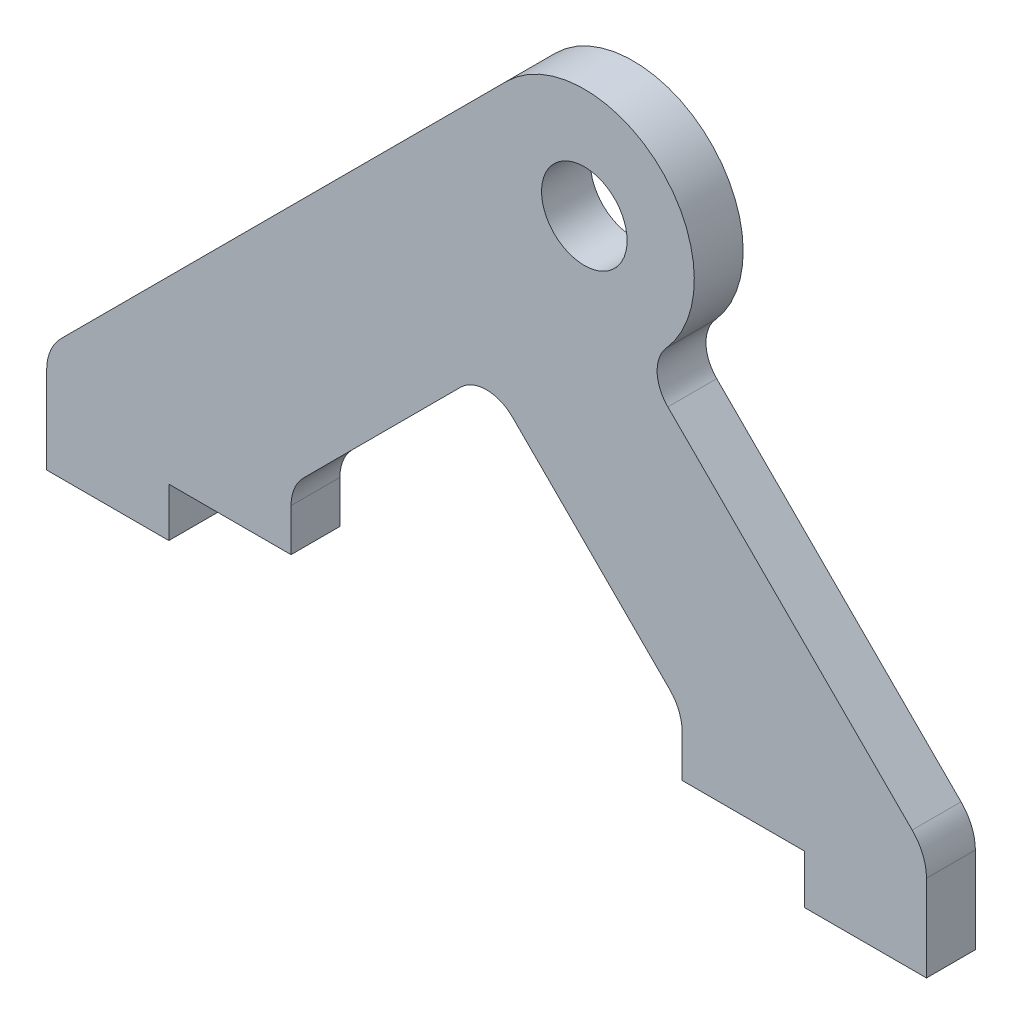
ISO-10303-21;
HEADER;
FILE_DESCRIPTION(('STEP AP214'),'2;1');
FILE_NAME('part.step','',(''),(''),'','','');
FILE_SCHEMA(('AUTOMOTIVE_DESIGN { 1 0 10303 214 1 1 1 1 }'));
ENDSEC;
DATA;
#1=APPLICATION_CONTEXT('core data for automotive mechanical design processes');
#2=APPLICATION_PROTOCOL_DEFINITION('international standard','automotive_design',2000,#1);
#3=PRODUCT_CONTEXT('',#1,'mechanical');
#4=PRODUCT('Part','Part','',(#3));
#5=PRODUCT_RELATED_PRODUCT_CATEGORY('part','',(#4));
#6=PRODUCT_DEFINITION_FORMATION('','',#4);
#7=PRODUCT_DEFINITION_CONTEXT('part definition',#1,'design');
#8=PRODUCT_DEFINITION('design','',#6,#7);
#9=PRODUCT_DEFINITION_SHAPE('','',#8);
#10=(LENGTH_UNIT() NAMED_UNIT(*) SI_UNIT(.MILLI.,.METRE.));
#11=(NAMED_UNIT(*) PLANE_ANGLE_UNIT() SI_UNIT($,.RADIAN.));
#12=(NAMED_UNIT(*) SI_UNIT($,.STERADIAN.) SOLID_ANGLE_UNIT());
#13=UNCERTAINTY_MEASURE_WITH_UNIT(LENGTH_MEASURE(1.E-05),#10,'distance_accuracy_value','');
#14=(GEOMETRIC_REPRESENTATION_CONTEXT(3) GLOBAL_UNCERTAINTY_ASSIGNED_CONTEXT((#13)) GLOBAL_UNIT_ASSIGNED_CONTEXT((#10,
#11,#12)) REPRESENTATION_CONTEXT('',''));
#15=CARTESIAN_POINT('',(0.,0.,0.));
#16=DIRECTION('',(0.,0.,1.));
#17=DIRECTION('',(1.,0.,0.));
#18=AXIS2_PLACEMENT_3D('',#15,#16,#17);
#19=CARTESIAN_POINT('',(26.4783372646557,16.0069441095828,2.));
#20=DIRECTION('',(0.,0.,-1.));
#21=DIRECTION('',(-1.,0.,0.));
#22=AXIS2_PLACEMENT_3D('',#19,#20,#21);
#23=PLANE('',#22);
#24=CARTESIAN_POINT('',(26.4783372646557,16.0069441095828,2.));
#25=DIRECTION('',(0.,0.,-1.));
#26=DIRECTION('',(-1.,0.,0.));
#27=AXIS2_PLACEMENT_3D('',#24,#25,#26);
#28=CIRCLE('',#27,1.5);
#29=CARTESIAN_POINT('',(25.4176770928759,14.9462839378029,2.));
#30=VERTEX_POINT('',#29);
#31=CARTESIAN_POINT('',(25.3587529484918,17.0052080821871,2.));
#32=VERTEX_POINT('',#31);
#33=EDGE_CURVE('E250',#30,#32,#28,.T.);
#34=ORIENTED_EDGE('',*,*,#33,.T.);
#35=CARTESIAN_POINT('',(22.,20.,2.));
#36=DIRECTION('',(0.,0.,1.));
#37=DIRECTION('',(1.,0.,0.));
#38=AXIS2_PLACEMENT_3D('',#35,#36,#37);
#39=CIRCLE('',#38,4.5);
#40=CARTESIAN_POINT('',(18.8180194846605,23.1819805153395,2.));
#41=VERTEX_POINT('',#40);
#42=EDGE_CURVE('E133',#32,#41,#39,.T.);
#43=ORIENTED_EDGE('',*,*,#42,.T.);
#44=DIRECTION('',(-0.707106781186546,-0.707106781186549,0.));
#45=VECTOR('',#44,1.);
#46=CARTESIAN_POINT('',(0.585786437626902,4.94974746830575,2.));
#47=LINE('',#46,#45);
#48=CARTESIAN_POINT('',(0.585786437626902,4.94974746830575,2.));
#49=VERTEX_POINT('',#48);
#50=EDGE_CURVE('E304',#41,#49,#47,.T.);
#51=ORIENTED_EDGE('',*,*,#50,.T.);
#52=CARTESIAN_POINT('',(2.,3.53553390593266,2.));
#53=DIRECTION('',(0.,0.,1.));
#54=DIRECTION('',(-1.,0.,0.));
#55=AXIS2_PLACEMENT_3D('',#52,#53,#54);
#56=CIRCLE('',#55,2.);
#57=CARTESIAN_POINT('',(0.,3.53553390593266,2.));
#58=VERTEX_POINT('',#57);
#59=EDGE_CURVE('E323',#49,#58,#56,.T.);
#60=ORIENTED_EDGE('',*,*,#59,.T.);
#61=DIRECTION('',(0.,-1.,0.));
#62=VECTOR('',#61,1.);
#63=CARTESIAN_POINT('',(0.,0.,2.));
#64=LINE('',#63,#62);
#65=CARTESIAN_POINT('',(0.,0.,2.));
#66=VERTEX_POINT('',#65);
#67=EDGE_CURVE('E320',#58,#66,#64,.T.);
#68=ORIENTED_EDGE('',*,*,#67,.T.);
#69=DIRECTION('',(1.,0.,0.));
#70=VECTOR('',#69,1.);
#71=CARTESIAN_POINT('',(0.,0.,2.));
#72=LINE('',#71,#70);
#73=CARTESIAN_POINT('',(5.,0.,2.));
#74=VERTEX_POINT('',#73);
#75=EDGE_CURVE('E322',#66,#74,#72,.T.);
#76=ORIENTED_EDGE('',*,*,#75,.T.);
#77=DIRECTION('',(0.,1.,0.));
#78=VECTOR('',#77,1.);
#79=CARTESIAN_POINT('',(5.,0.,2.));
#80=LINE('',#79,#78);
#81=CARTESIAN_POINT('',(5.,2.,2.));
#82=VERTEX_POINT('',#81);
#83=EDGE_CURVE('E325',#74,#82,#80,.T.);
#84=ORIENTED_EDGE('',*,*,#83,.T.);
#85=DIRECTION('',(1.,0.,0.));
#86=VECTOR('',#85,1.);
#87=CARTESIAN_POINT('',(5.,2.,2.));
#88=LINE('',#87,#86);
#89=CARTESIAN_POINT('',(10.,2.,2.));
#90=VERTEX_POINT('',#89);
#91=EDGE_CURVE('E331',#82,#90,#88,.T.);
#92=ORIENTED_EDGE('',*,*,#91,.T.);
#93=DIRECTION('',(0.,1.,0.));
#94=VECTOR('',#93,1.);
#95=CARTESIAN_POINT('',(10.,2.,2.));
#96=LINE('',#95,#94);
#97=CARTESIAN_POINT('',(10.,3.73959235991429,2.));
#98=VERTEX_POINT('',#97);
#99=EDGE_CURVE('E333',#90,#98,#96,.T.);
#100=ORIENTED_EDGE('',*,*,#99,.T.);
#101=CARTESIAN_POINT('',(11.75,3.73959235991429,2.));
#102=DIRECTION('',(0.,0.,-1.));
#103=DIRECTION('',(-1.,0.,0.));
#104=AXIS2_PLACEMENT_3D('',#101,#102,#103);
#105=CIRCLE('',#104,1.75);
#106=CARTESIAN_POINT('',(10.5125631329235,4.97702922699074,2.));
#107=VERTEX_POINT('',#106);
#108=EDGE_CURVE('E335',#98,#107,#105,.T.);
#109=ORIENTED_EDGE('',*,*,#108,.T.);
#110=DIRECTION('',(0.707106781186546,0.707106781186549,0.));
#111=VECTOR('',#110,1.);
#112=CARTESIAN_POINT('',(10.5125631329235,4.97702922699074,2.));
#113=LINE('',#112,#111);
#114=CARTESIAN_POINT('',(16.9393398282201,11.4038059222874,2.));
#115=VERTEX_POINT('',#114);
#116=EDGE_CURVE('E337',#107,#115,#113,.T.);
#117=ORIENTED_EDGE('',*,*,#116,.T.);
#118=CARTESIAN_POINT('',(18.,10.3431457505076,2.));
#119=DIRECTION('',(0.,0.,-1.));
#120=DIRECTION('',(-1.,0.,0.));
#121=AXIS2_PLACEMENT_3D('',#118,#119,#120);
#122=CIRCLE('',#121,1.5);
#123=CARTESIAN_POINT('',(19.0606601717798,11.4038059222874,2.));
#124=VERTEX_POINT('',#123);
#125=EDGE_CURVE('E339',#115,#124,#122,.T.);
#126=ORIENTED_EDGE('',*,*,#125,.T.);
#127=DIRECTION('',(0.707106781186549,-0.707106781186546,0.));
#128=VECTOR('',#127,1.);
#129=CARTESIAN_POINT('',(19.0606601717798,11.4038059222874,2.));
#130=LINE('',#129,#128);
#131=CARTESIAN_POINT('',(25.4874368670765,4.97702922699075,2.));
#132=VERTEX_POINT('',#131);
#133=EDGE_CURVE('E341',#124,#132,#130,.T.);
#134=ORIENTED_EDGE('',*,*,#133,.T.);
#135=CARTESIAN_POINT('',(24.25,3.73959235991429,2.));
#136=DIRECTION('',(0.,0.,-1.));
#137=DIRECTION('',(-1.,0.,0.));
#138=AXIS2_PLACEMENT_3D('',#135,#136,#137);
#139=CIRCLE('',#138,1.75);
#140=CARTESIAN_POINT('',(26.,3.73959235991429,2.));
#141=VERTEX_POINT('',#140);
#142=EDGE_CURVE('E343',#132,#141,#139,.T.);
#143=ORIENTED_EDGE('',*,*,#142,.T.);
#144=DIRECTION('',(0.,-1.,0.));
#145=VECTOR('',#144,1.);
#146=CARTESIAN_POINT('',(26.,3.73959235991429,2.));
#147=LINE('',#146,#145);
#148=CARTESIAN_POINT('',(26.,2.,2.));
#149=VERTEX_POINT('',#148);
#150=EDGE_CURVE('E345',#141,#149,#147,.T.);
#151=ORIENTED_EDGE('',*,*,#150,.T.);
#152=DIRECTION('',(1.,0.,0.));
#153=VECTOR('',#152,1.);
#154=CARTESIAN_POINT('',(26.,2.,2.));
#155=LINE('',#154,#153);
#156=CARTESIAN_POINT('',(31.,2.,2.));
#157=VERTEX_POINT('',#156);
#158=EDGE_CURVE('E347',#149,#157,#155,.T.);
#159=ORIENTED_EDGE('',*,*,#158,.T.);
#160=DIRECTION('',(0.,-1.,0.));
#161=VECTOR('',#160,1.);
#162=CARTESIAN_POINT('',(31.,2.,2.));
#163=LINE('',#162,#161);
#164=CARTESIAN_POINT('',(31.,0.,2.));
#165=VERTEX_POINT('',#164);
#166=EDGE_CURVE('E349',#157,#165,#163,.T.);
#167=ORIENTED_EDGE('',*,*,#166,.T.);
#168=DIRECTION('',(1.,0.,0.));
#169=VECTOR('',#168,1.);
#170=CARTESIAN_POINT('',(31.,0.,2.));
#171=LINE('',#170,#169);
#172=CARTESIAN_POINT('',(36.,0.,2.));
#173=VERTEX_POINT('',#172);
#174=EDGE_CURVE('E191',#165,#173,#171,.T.);
#175=ORIENTED_EDGE('',*,*,#174,.T.);
#176=DIRECTION('',(0.,1.,0.));
#177=VECTOR('',#176,1.);
#178=CARTESIAN_POINT('',(36.,0.,2.));
#179=LINE('',#178,#177);
#180=CARTESIAN_POINT('',(36.,3.5355339059327,2.));
#181=VERTEX_POINT('',#180);
#182=EDGE_CURVE('E185',#173,#181,#179,.T.);
#183=ORIENTED_EDGE('',*,*,#182,.T.);
#184=CARTESIAN_POINT('',(34.,3.5355339059327,2.));
#185=DIRECTION('',(0.,0.,1.));
#186=DIRECTION('',(1.,0.,0.));
#187=AXIS2_PLACEMENT_3D('',#184,#185,#186);
#188=CIRCLE('',#187,2.);
#189=CARTESIAN_POINT('',(35.4142135623731,4.94974746830579,2.));
#190=VERTEX_POINT('',#189);
#191=EDGE_CURVE('E189',#181,#190,#188,.T.);
#192=ORIENTED_EDGE('',*,*,#191,.T.);
#193=DIRECTION('',(-0.707106781186549,0.707106781186546,0.));
#194=VECTOR('',#193,1.);
#195=CARTESIAN_POINT('',(35.4142135623731,4.94974746830579,2.));
#196=LINE('',#195,#194);
#197=EDGE_CURVE('E51',#190,#30,#196,.T.);
#198=ORIENTED_EDGE('',*,*,#197,.T.);
#199=EDGE_LOOP('',(#34,#43,#51,#60,#68,#76,#84,#92,#100,#109,#117,#126,#134,#143,#151,#159,#167,
#175,#183,#192,#198));
#200=FACE_BOUND('',#199,.T.);
#201=CARTESIAN_POINT('',(22.,20.,2.));
#202=DIRECTION('',(0.,0.,1.));
#203=DIRECTION('',(1.,0.,0.));
#204=AXIS2_PLACEMENT_3D('',#201,#202,#203);
#205=CIRCLE('',#204,1.75);
#206=CARTESIAN_POINT('',(23.75,20.,2.));
#207=VERTEX_POINT('',#206);
#208=EDGE_CURVE('E213',#207,#207,#205,.T.);
#209=ORIENTED_EDGE('',*,*,#208,.F.);
#210=EDGE_LOOP('',(#209));
#211=FACE_BOUND('',#210,.T.);
#212=ADVANCED_FACE('F34',(#200,#211),#23,.F.);
#213=CARTESIAN_POINT('',(26.4783372646557,16.0069441095828,0.));
#214=DIRECTION('',(0.,0.,-1.));
#215=DIRECTION('',(-1.,0.,0.));
#216=AXIS2_PLACEMENT_3D('',#213,#214,#215);
#217=PLANE('',#216);
#218=CARTESIAN_POINT('',(26.4783372646557,16.0069441095828,0.));
#219=DIRECTION('',(0.,0.,-1.));
#220=DIRECTION('',(-1.,0.,0.));
#221=AXIS2_PLACEMENT_3D('',#218,#219,#220);
#222=CIRCLE('',#221,1.5);
#223=CARTESIAN_POINT('',(25.4176770928759,14.9462839378029,0.));
#224=VERTEX_POINT('',#223);
#225=CARTESIAN_POINT('',(25.3587529484918,17.0052080821871,0.));
#226=VERTEX_POINT('',#225);
#227=EDGE_CURVE('E209',#224,#226,#222,.T.);
#228=ORIENTED_EDGE('',*,*,#227,.F.);
#229=DIRECTION('',(-0.707106781186549,0.707106781186546,0.));
#230=VECTOR('',#229,1.);
#231=CARTESIAN_POINT('',(35.4142135623731,4.94974746830579,0.));
#232=LINE('',#231,#230);
#233=CARTESIAN_POINT('',(35.4142135623731,4.94974746830579,0.));
#234=VERTEX_POINT('',#233);
#235=EDGE_CURVE('E125',#234,#224,#232,.T.);
#236=ORIENTED_EDGE('',*,*,#235,.F.);
#237=CARTESIAN_POINT('',(34.,3.5355339059327,0.));
#238=DIRECTION('',(0.,0.,1.));
#239=DIRECTION('',(1.,0.,0.));
#240=AXIS2_PLACEMENT_3D('',#237,#238,#239);
#241=CIRCLE('',#240,2.);
#242=CARTESIAN_POINT('',(36.,3.5355339059327,0.));
#243=VERTEX_POINT('',#242);
#244=EDGE_CURVE('E119',#243,#234,#241,.T.);
#245=ORIENTED_EDGE('',*,*,#244,.F.);
#246=DIRECTION('',(0.,1.,0.));
#247=VECTOR('',#246,1.);
#248=CARTESIAN_POINT('',(36.,0.,0.));
#249=LINE('',#248,#247);
#250=CARTESIAN_POINT('',(36.,0.,0.));
#251=VERTEX_POINT('',#250);
#252=EDGE_CURVE('E199',#251,#243,#249,.T.);
#253=ORIENTED_EDGE('',*,*,#252,.F.);
#254=DIRECTION('',(1.,0.,0.));
#255=VECTOR('',#254,1.);
#256=CARTESIAN_POINT('',(31.,0.,0.));
#257=LINE('',#256,#255);
#258=CARTESIAN_POINT('',(31.,0.,0.));
#259=VERTEX_POINT('',#258);
#260=EDGE_CURVE('E245',#259,#251,#257,.T.);
#261=ORIENTED_EDGE('',*,*,#260,.F.);
#262=DIRECTION('',(0.,-1.,0.));
#263=VECTOR('',#262,1.);
#264=CARTESIAN_POINT('',(31.,2.,0.));
#265=LINE('',#264,#263);
#266=CARTESIAN_POINT('',(31.,2.,0.));
#267=VERTEX_POINT('',#266);
#268=EDGE_CURVE('E243',#267,#259,#265,.T.);
#269=ORIENTED_EDGE('',*,*,#268,.F.);
#270=DIRECTION('',(1.,0.,0.));
#271=VECTOR('',#270,1.);
#272=CARTESIAN_POINT('',(26.,2.,0.));
#273=LINE('',#272,#271);
#274=CARTESIAN_POINT('',(26.,2.,0.));
#275=VERTEX_POINT('',#274);
#276=EDGE_CURVE('E241',#275,#267,#273,.T.);
#277=ORIENTED_EDGE('',*,*,#276,.F.);
#278=DIRECTION('',(0.,-1.,0.));
#279=VECTOR('',#278,1.);
#280=CARTESIAN_POINT('',(26.,3.73959235991429,0.));
#281=LINE('',#280,#279);
#282=CARTESIAN_POINT('',(26.,3.73959235991429,0.));
#283=VERTEX_POINT('',#282);
#284=EDGE_CURVE('E239',#283,#275,#281,.T.);
#285=ORIENTED_EDGE('',*,*,#284,.F.);
#286=CARTESIAN_POINT('',(24.25,3.73959235991429,0.));
#287=DIRECTION('',(0.,0.,-1.));
#288=DIRECTION('',(-1.,0.,0.));
#289=AXIS2_PLACEMENT_3D('',#286,#287,#288);
#290=CIRCLE('',#289,1.75);
#291=CARTESIAN_POINT('',(25.4874368670765,4.97702922699075,0.));
#292=VERTEX_POINT('',#291);
#293=EDGE_CURVE('E237',#292,#283,#290,.T.);
#294=ORIENTED_EDGE('',*,*,#293,.F.);
#295=DIRECTION('',(0.707106781186549,-0.707106781186546,0.));
#296=VECTOR('',#295,1.);
#297=CARTESIAN_POINT('',(19.0606601717798,11.4038059222874,0.));
#298=LINE('',#297,#296);
#299=CARTESIAN_POINT('',(19.0606601717798,11.4038059222874,0.));
#300=VERTEX_POINT('',#299);
#301=EDGE_CURVE('E235',#300,#292,#298,.T.);
#302=ORIENTED_EDGE('',*,*,#301,.F.);
#303=CARTESIAN_POINT('',(18.,10.3431457505076,0.));
#304=DIRECTION('',(0.,0.,-1.));
#305=DIRECTION('',(-1.,0.,0.));
#306=AXIS2_PLACEMENT_3D('',#303,#304,#305);
#307=CIRCLE('',#306,1.5);
#308=CARTESIAN_POINT('',(16.9393398282201,11.4038059222874,0.));
#309=VERTEX_POINT('',#308);
#310=EDGE_CURVE('E233',#309,#300,#307,.T.);
#311=ORIENTED_EDGE('',*,*,#310,.F.);
#312=DIRECTION('',(0.707106781186546,0.707106781186549,0.));
#313=VECTOR('',#312,1.);
#314=CARTESIAN_POINT('',(10.5125631329235,4.97702922699074,0.));
#315=LINE('',#314,#313);
#316=CARTESIAN_POINT('',(10.5125631329235,4.97702922699074,0.));
#317=VERTEX_POINT('',#316);
#318=EDGE_CURVE('E231',#317,#309,#315,.T.);
#319=ORIENTED_EDGE('',*,*,#318,.F.);
#320=CARTESIAN_POINT('',(11.75,3.73959235991429,0.));
#321=DIRECTION('',(0.,0.,-1.));
#322=DIRECTION('',(-1.,0.,0.));
#323=AXIS2_PLACEMENT_3D('',#320,#321,#322);
#324=CIRCLE('',#323,1.75);
#325=CARTESIAN_POINT('',(10.,3.73959235991429,0.));
#326=VERTEX_POINT('',#325);
#327=EDGE_CURVE('E229',#326,#317,#324,.T.);
#328=ORIENTED_EDGE('',*,*,#327,.F.);
#329=DIRECTION('',(0.,1.,0.));
#330=VECTOR('',#329,1.);
#331=CARTESIAN_POINT('',(10.,2.,0.));
#332=LINE('',#331,#330);
#333=CARTESIAN_POINT('',(10.,2.,0.));
#334=VERTEX_POINT('',#333);
#335=EDGE_CURVE('E227',#334,#326,#332,.T.);
#336=ORIENTED_EDGE('',*,*,#335,.F.);
#337=DIRECTION('',(1.,0.,0.));
#338=VECTOR('',#337,1.);
#339=CARTESIAN_POINT('',(5.,2.,0.));
#340=LINE('',#339,#338);
#341=CARTESIAN_POINT('',(5.,2.,0.));
#342=VERTEX_POINT('',#341);
#343=EDGE_CURVE('E225',#342,#334,#340,.T.);
#344=ORIENTED_EDGE('',*,*,#343,.F.);
#345=DIRECTION('',(0.,1.,0.));
#346=VECTOR('',#345,1.);
#347=CARTESIAN_POINT('',(5.,0.,0.));
#348=LINE('',#347,#346);
#349=CARTESIAN_POINT('',(5.,0.,0.));
#350=VERTEX_POINT('',#349);
#351=EDGE_CURVE('E223',#350,#342,#348,.T.);
#352=ORIENTED_EDGE('',*,*,#351,.F.);
#353=DIRECTION('',(1.,0.,0.));
#354=VECTOR('',#353,1.);
#355=CARTESIAN_POINT('',(0.,0.,0.));
#356=LINE('',#355,#354);
#357=CARTESIAN_POINT('',(0.,0.,0.));
#358=VERTEX_POINT('',#357);
#359=EDGE_CURVE('E221',#358,#350,#356,.T.);
#360=ORIENTED_EDGE('',*,*,#359,.F.);
#361=DIRECTION('',(0.,-1.,0.));
#362=VECTOR('',#361,1.);
#363=CARTESIAN_POINT('',(0.,0.,0.));
#364=LINE('',#363,#362);
#365=CARTESIAN_POINT('',(0.,3.53553390593266,0.));
#366=VERTEX_POINT('',#365);
#367=EDGE_CURVE('E219',#366,#358,#364,.T.);
#368=ORIENTED_EDGE('',*,*,#367,.F.);
#369=CARTESIAN_POINT('',(2.,3.53553390593266,0.));
#370=DIRECTION('',(0.,0.,1.));
#371=DIRECTION('',(-1.,0.,0.));
#372=AXIS2_PLACEMENT_3D('',#369,#370,#371);
#373=CIRCLE('',#372,2.);
#374=CARTESIAN_POINT('',(0.585786437626902,4.94974746830575,0.));
#375=VERTEX_POINT('',#374);
#376=EDGE_CURVE('E217',#375,#366,#373,.T.);
#377=ORIENTED_EDGE('',*,*,#376,.F.);
#378=DIRECTION('',(-0.707106781186546,-0.707106781186549,0.));
#379=VECTOR('',#378,1.);
#380=CARTESIAN_POINT('',(0.585786437626902,4.94974746830575,0.));
#381=LINE('',#380,#379);
#382=CARTESIAN_POINT('',(18.8180194846605,23.1819805153395,0.));
#383=VERTEX_POINT('',#382);
#384=EDGE_CURVE('E215',#383,#375,#381,.T.);
#385=ORIENTED_EDGE('',*,*,#384,.F.);
#386=CARTESIAN_POINT('',(22.,20.,0.));
#387=DIRECTION('',(0.,0.,1.));
#388=DIRECTION('',(1.,0.,0.));
#389=AXIS2_PLACEMENT_3D('',#386,#387,#388);
#390=CIRCLE('',#389,4.5);
#391=EDGE_CURVE('E212',#226,#383,#390,.T.);
#392=ORIENTED_EDGE('',*,*,#391,.F.);
#393=EDGE_LOOP('',(#228,#236,#245,#253,#261,#269,#277,#285,#294,#302,#311,#319,#328,#336,#344,
#352,#360,#368,#377,#385,#392));
#394=FACE_BOUND('',#393,.T.);
#395=CARTESIAN_POINT('',(22.,20.,0.));
#396=DIRECTION('',(0.,0.,1.));
#397=DIRECTION('',(1.,0.,0.));
#398=AXIS2_PLACEMENT_3D('',#395,#396,#397);
#399=CIRCLE('',#398,1.75);
#400=CARTESIAN_POINT('',(23.75,20.,0.));
#401=VERTEX_POINT('',#400);
#402=EDGE_CURVE('E613',#401,#401,#399,.T.);
#403=ORIENTED_EDGE('',*,*,#402,.T.);
#404=EDGE_LOOP('',(#403));
#405=FACE_BOUND('',#404,.T.);
#406=ADVANCED_FACE('F308',(#394,#405),#217,.T.);
#407=CARTESIAN_POINT('',(26.4783372646557,16.0069441095828,2.));
#408=DIRECTION('',(0.,0.,-1.));
#409=DIRECTION('',(-1.,0.,0.));
#410=AXIS2_PLACEMENT_3D('',#407,#408,#409);
#411=CYLINDRICAL_SURFACE('',#410,1.5);
#412=ORIENTED_EDGE('',*,*,#227,.T.);
#413=DIRECTION('',(0.,0.,-1.));
#414=VECTOR('',#413,1.);
#415=CARTESIAN_POINT('',(25.3587529484918,17.0052080821871,2.));
#416=LINE('',#415,#414);
#417=EDGE_CURVE('E11',#32,#226,#416,.T.);
#418=ORIENTED_EDGE('',*,*,#417,.F.);
#419=ORIENTED_EDGE('',*,*,#33,.F.);
#420=DIRECTION('',(0.,0.,-1.));
#421=VECTOR('',#420,1.);
#422=CARTESIAN_POINT('',(25.4176770928759,14.9462839378029,2.));
#423=LINE('',#422,#421);
#424=EDGE_CURVE('E205',#30,#224,#423,.T.);
#425=ORIENTED_EDGE('',*,*,#424,.T.);
#426=EDGE_LOOP('',(#412,#418,#419,#425));
#427=FACE_BOUND('',#426,.T.);
#428=ADVANCED_FACE('F36',(#427),#411,.F.);
#429=CARTESIAN_POINT('',(22.,20.,2.));
#430=DIRECTION('',(0.,0.,-1.));
#431=DIRECTION('',(-1.,0.,0.));
#432=AXIS2_PLACEMENT_3D('',#429,#430,#431);
#433=CYLINDRICAL_SURFACE('',#432,4.5);
#434=ORIENTED_EDGE('',*,*,#391,.T.);
#435=DIRECTION('',(0.,0.,-1.));
#436=VECTOR('',#435,1.);
#437=CARTESIAN_POINT('',(18.8180194846605,23.1819805153395,2.));
#438=LINE('',#437,#436);
#439=EDGE_CURVE('E43',#41,#383,#438,.T.);
#440=ORIENTED_EDGE('',*,*,#439,.F.);
#441=ORIENTED_EDGE('',*,*,#42,.F.);
#442=ORIENTED_EDGE('',*,*,#417,.T.);
#443=EDGE_LOOP('',(#434,#440,#441,#442));
#444=FACE_BOUND('',#443,.T.);
#445=ADVANCED_FACE('F383',(#444),#433,.T.);
#446=CARTESIAN_POINT('',(0.585786437626902,4.94974746830575,2.));
#447=DIRECTION('',(0.707106781186549,-0.707106781186546,0.));
#448=DIRECTION('',(0.707106781186546,0.707106781186549,0.));
#449=AXIS2_PLACEMENT_3D('',#446,#447,#448);
#450=PLANE('',#449);
#451=ORIENTED_EDGE('',*,*,#384,.T.);
#452=DIRECTION('',(0.,0.,-1.));
#453=VECTOR('',#452,1.);
#454=CARTESIAN_POINT('',(0.585786437626902,4.94974746830575,2.));
#455=LINE('',#454,#453);
#456=EDGE_CURVE('E296',#49,#375,#455,.T.);
#457=ORIENTED_EDGE('',*,*,#456,.F.);
#458=ORIENTED_EDGE('',*,*,#50,.F.);
#459=ORIENTED_EDGE('',*,*,#439,.T.);
#460=EDGE_LOOP('',(#451,#457,#458,#459));
#461=FACE_BOUND('',#460,.T.);
#462=ADVANCED_FACE('F302',(#461),#450,.F.);
#463=CARTESIAN_POINT('',(2.,3.53553390593266,2.));
#464=DIRECTION('',(0.,0.,-1.));
#465=DIRECTION('',(-1.,0.,0.));
#466=AXIS2_PLACEMENT_3D('',#463,#464,#465);
#467=CYLINDRICAL_SURFACE('',#466,2.);
#468=ORIENTED_EDGE('',*,*,#376,.T.);
#469=DIRECTION('',(0.,0.,-1.));
#470=VECTOR('',#469,1.);
#471=CARTESIAN_POINT('',(0.,3.53553390593266,2.));
#472=LINE('',#471,#470);
#473=EDGE_CURVE('E293',#58,#366,#472,.T.);
#474=ORIENTED_EDGE('',*,*,#473,.F.);
#475=ORIENTED_EDGE('',*,*,#59,.F.);
#476=ORIENTED_EDGE('',*,*,#456,.T.);
#477=EDGE_LOOP('',(#468,#474,#475,#476));
#478=FACE_BOUND('',#477,.T.);
#479=ADVANCED_FACE('F314',(#478),#467,.T.);
#480=CARTESIAN_POINT('',(0.,0.,2.));
#481=DIRECTION('',(1.,0.,0.));
#482=DIRECTION('',(0.,1.,0.));
#483=AXIS2_PLACEMENT_3D('',#480,#481,#482);
#484=PLANE('',#483);
#485=ORIENTED_EDGE('',*,*,#367,.T.);
#486=DIRECTION('',(0.,0.,-1.));
#487=VECTOR('',#486,1.);
#488=CARTESIAN_POINT('',(0.,0.,2.));
#489=LINE('',#488,#487);
#490=EDGE_CURVE('E290',#66,#358,#489,.T.);
#491=ORIENTED_EDGE('',*,*,#490,.F.);
#492=ORIENTED_EDGE('',*,*,#67,.F.);
#493=ORIENTED_EDGE('',*,*,#473,.T.);
#494=EDGE_LOOP('',(#485,#491,#492,#493));
#495=FACE_BOUND('',#494,.T.);
#496=ADVANCED_FACE('F318',(#495),#484,.F.);
#497=CARTESIAN_POINT('',(0.,0.,2.));
#498=DIRECTION('',(0.,1.,0.));
#499=DIRECTION('',(0.,0.,1.));
#500=AXIS2_PLACEMENT_3D('',#497,#498,#499);
#501=PLANE('',#500);
#502=ORIENTED_EDGE('',*,*,#359,.T.);
#503=DIRECTION('',(0.,0.,-1.));
#504=VECTOR('',#503,1.);
#505=CARTESIAN_POINT('',(5.,0.,2.));
#506=LINE('',#505,#504);
#507=EDGE_CURVE('E287',#74,#350,#506,.T.);
#508=ORIENTED_EDGE('',*,*,#507,.F.);
#509=ORIENTED_EDGE('',*,*,#75,.F.);
#510=ORIENTED_EDGE('',*,*,#490,.T.);
#511=EDGE_LOOP('',(#502,#508,#509,#510));
#512=FACE_BOUND('',#511,.T.);
#513=ADVANCED_FACE('F396',(#512),#501,.F.);
#514=CARTESIAN_POINT('',(5.,0.,2.));
#515=DIRECTION('',(-1.,0.,0.));
#516=DIRECTION('',(0.,0.,1.));
#517=AXIS2_PLACEMENT_3D('',#514,#515,#516);
#518=PLANE('',#517);
#519=ORIENTED_EDGE('',*,*,#351,.T.);
#520=DIRECTION('',(0.,0.,-1.));
#521=VECTOR('',#520,1.);
#522=CARTESIAN_POINT('',(5.,2.,2.));
#523=LINE('',#522,#521);
#524=EDGE_CURVE('E284',#82,#342,#523,.T.);
#525=ORIENTED_EDGE('',*,*,#524,.F.);
#526=ORIENTED_EDGE('',*,*,#83,.F.);
#527=ORIENTED_EDGE('',*,*,#507,.T.);
#528=EDGE_LOOP('',(#519,#525,#526,#527));
#529=FACE_BOUND('',#528,.T.);
#530=ADVANCED_FACE('F399',(#529),#518,.F.);
#531=CARTESIAN_POINT('',(5.,2.,2.));
#532=DIRECTION('',(0.,1.,0.));
#533=DIRECTION('',(0.,0.,1.));
#534=AXIS2_PLACEMENT_3D('',#531,#532,#533);
#535=PLANE('',#534);
#536=ORIENTED_EDGE('',*,*,#343,.T.);
#537=DIRECTION('',(0.,0.,-1.));
#538=VECTOR('',#537,1.);
#539=CARTESIAN_POINT('',(10.,2.,2.));
#540=LINE('',#539,#538);
#541=EDGE_CURVE('E281',#90,#334,#540,.T.);
#542=ORIENTED_EDGE('',*,*,#541,.F.);
#543=ORIENTED_EDGE('',*,*,#91,.F.);
#544=ORIENTED_EDGE('',*,*,#524,.T.);
#545=EDGE_LOOP('',(#536,#542,#543,#544));
#546=FACE_BOUND('',#545,.T.);
#547=ADVANCED_FACE('F403',(#546),#535,.F.);
#548=CARTESIAN_POINT('',(10.,2.,2.));
#549=DIRECTION('',(-1.,0.,0.));
#550=DIRECTION('',(0.,0.,1.));
#551=AXIS2_PLACEMENT_3D('',#548,#549,#550);
#552=PLANE('',#551);
#553=ORIENTED_EDGE('',*,*,#335,.T.);
#554=DIRECTION('',(0.,0.,-1.));
#555=VECTOR('',#554,1.);
#556=CARTESIAN_POINT('',(10.,3.73959235991429,2.));
#557=LINE('',#556,#555);
#558=EDGE_CURVE('E278',#98,#326,#557,.T.);
#559=ORIENTED_EDGE('',*,*,#558,.F.);
#560=ORIENTED_EDGE('',*,*,#99,.F.);
#561=ORIENTED_EDGE('',*,*,#541,.T.);
#562=EDGE_LOOP('',(#553,#559,#560,#561));
#563=FACE_BOUND('',#562,.T.);
#564=ADVANCED_FACE('F407',(#563),#552,.F.);
#565=CARTESIAN_POINT('',(11.75,3.73959235991429,2.));
#566=DIRECTION('',(0.,0.,-1.));
#567=DIRECTION('',(-1.,0.,0.));
#568=AXIS2_PLACEMENT_3D('',#565,#566,#567);
#569=CYLINDRICAL_SURFACE('',#568,1.75);
#570=ORIENTED_EDGE('',*,*,#327,.T.);
#571=DIRECTION('',(0.,0.,-1.));
#572=VECTOR('',#571,1.);
#573=CARTESIAN_POINT('',(10.5125631329235,4.97702922699074,2.));
#574=LINE('',#573,#572);
#575=EDGE_CURVE('E275',#107,#317,#574,.T.);
#576=ORIENTED_EDGE('',*,*,#575,.F.);
#577=ORIENTED_EDGE('',*,*,#108,.F.);
#578=ORIENTED_EDGE('',*,*,#558,.T.);
#579=EDGE_LOOP('',(#570,#576,#577,#578));
#580=FACE_BOUND('',#579,.T.);
#581=ADVANCED_FACE('F411',(#580),#569,.F.);
#582=CARTESIAN_POINT('',(10.5125631329235,4.97702922699074,2.));
#583=DIRECTION('',(-0.707106781186549,0.707106781186546,0.));
#584=DIRECTION('',(-0.707106781186546,-0.707106781186549,0.));
#585=AXIS2_PLACEMENT_3D('',#582,#583,#584);
#586=PLANE('',#585);
#587=ORIENTED_EDGE('',*,*,#318,.T.);
#588=DIRECTION('',(0.,0.,-1.));
#589=VECTOR('',#588,1.);
#590=CARTESIAN_POINT('',(16.9393398282201,11.4038059222874,2.));
#591=LINE('',#590,#589);
#592=EDGE_CURVE('E272',#115,#309,#591,.T.);
#593=ORIENTED_EDGE('',*,*,#592,.F.);
#594=ORIENTED_EDGE('',*,*,#116,.F.);
#595=ORIENTED_EDGE('',*,*,#575,.T.);
#596=EDGE_LOOP('',(#587,#593,#594,#595));
#597=FACE_BOUND('',#596,.T.);
#598=ADVANCED_FACE('F415',(#597),#586,.F.);
#599=CARTESIAN_POINT('',(18.,10.3431457505076,2.));
#600=DIRECTION('',(0.,0.,-1.));
#601=DIRECTION('',(-1.,0.,0.));
#602=AXIS2_PLACEMENT_3D('',#599,#600,#601);
#603=CYLINDRICAL_SURFACE('',#602,1.5);
#604=ORIENTED_EDGE('',*,*,#310,.T.);
#605=DIRECTION('',(0.,0.,-1.));
#606=VECTOR('',#605,1.);
#607=CARTESIAN_POINT('',(19.0606601717798,11.4038059222874,2.));
#608=LINE('',#607,#606);
#609=EDGE_CURVE('E269',#124,#300,#608,.T.);
#610=ORIENTED_EDGE('',*,*,#609,.F.);
#611=ORIENTED_EDGE('',*,*,#125,.F.);
#612=ORIENTED_EDGE('',*,*,#592,.T.);
#613=EDGE_LOOP('',(#604,#610,#611,#612));
#614=FACE_BOUND('',#613,.T.);
#615=ADVANCED_FACE('F419',(#614),#603,.F.);
#616=CARTESIAN_POINT('',(19.0606601717798,11.4038059222874,2.));
#617=DIRECTION('',(0.707106781186546,0.707106781186549,0.));
#618=DIRECTION('',(-0.707106781186549,0.707106781186546,0.));
#619=AXIS2_PLACEMENT_3D('',#616,#617,#618);
#620=PLANE('',#619);
#621=ORIENTED_EDGE('',*,*,#301,.T.);
#622=DIRECTION('',(0.,0.,-1.));
#623=VECTOR('',#622,1.);
#624=CARTESIAN_POINT('',(25.4874368670765,4.97702922699075,2.));
#625=LINE('',#624,#623);
#626=EDGE_CURVE('E266',#132,#292,#625,.T.);
#627=ORIENTED_EDGE('',*,*,#626,.F.);
#628=ORIENTED_EDGE('',*,*,#133,.F.);
#629=ORIENTED_EDGE('',*,*,#609,.T.);
#630=EDGE_LOOP('',(#621,#627,#628,#629));
#631=FACE_BOUND('',#630,.T.);
#632=ADVANCED_FACE('F423',(#631),#620,.F.);
#633=CARTESIAN_POINT('',(24.25,3.73959235991429,2.));
#634=DIRECTION('',(0.,0.,-1.));
#635=DIRECTION('',(-1.,0.,0.));
#636=AXIS2_PLACEMENT_3D('',#633,#634,#635);
#637=CYLINDRICAL_SURFACE('',#636,1.75);
#638=ORIENTED_EDGE('',*,*,#293,.T.);
#639=DIRECTION('',(0.,0.,-1.));
#640=VECTOR('',#639,1.);
#641=CARTESIAN_POINT('',(26.,3.73959235991429,2.));
#642=LINE('',#641,#640);
#643=EDGE_CURVE('E263',#141,#283,#642,.T.);
#644=ORIENTED_EDGE('',*,*,#643,.F.);
#645=ORIENTED_EDGE('',*,*,#142,.F.);
#646=ORIENTED_EDGE('',*,*,#626,.T.);
#647=EDGE_LOOP('',(#638,#644,#645,#646));
#648=FACE_BOUND('',#647,.T.);
#649=ADVANCED_FACE('F427',(#648),#637,.F.);
#650=CARTESIAN_POINT('',(26.,3.73959235991429,2.));
#651=DIRECTION('',(1.,0.,0.));
#652=DIRECTION('',(0.,0.,-1.));
#653=AXIS2_PLACEMENT_3D('',#650,#651,#652);
#654=PLANE('',#653);
#655=ORIENTED_EDGE('',*,*,#284,.T.);
#656=DIRECTION('',(0.,0.,-1.));
#657=VECTOR('',#656,1.);
#658=CARTESIAN_POINT('',(26.,2.,2.));
#659=LINE('',#658,#657);
#660=EDGE_CURVE('E260',#149,#275,#659,.T.);
#661=ORIENTED_EDGE('',*,*,#660,.F.);
#662=ORIENTED_EDGE('',*,*,#150,.F.);
#663=ORIENTED_EDGE('',*,*,#643,.T.);
#664=EDGE_LOOP('',(#655,#661,#662,#663));
#665=FACE_BOUND('',#664,.T.);
#666=ADVANCED_FACE('F431',(#665),#654,.F.);
#667=CARTESIAN_POINT('',(26.,2.,2.));
#668=DIRECTION('',(0.,1.,0.));
#669=DIRECTION('',(0.,0.,1.));
#670=AXIS2_PLACEMENT_3D('',#667,#668,#669);
#671=PLANE('',#670);
#672=ORIENTED_EDGE('',*,*,#276,.T.);
#673=DIRECTION('',(0.,0.,-1.));
#674=VECTOR('',#673,1.);
#675=CARTESIAN_POINT('',(31.,2.,2.));
#676=LINE('',#675,#674);
#677=EDGE_CURVE('E257',#157,#267,#676,.T.);
#678=ORIENTED_EDGE('',*,*,#677,.F.);
#679=ORIENTED_EDGE('',*,*,#158,.F.);
#680=ORIENTED_EDGE('',*,*,#660,.T.);
#681=EDGE_LOOP('',(#672,#678,#679,#680));
#682=FACE_BOUND('',#681,.T.);
#683=ADVANCED_FACE('F435',(#682),#671,.F.);
#684=CARTESIAN_POINT('',(31.,2.,2.));
#685=DIRECTION('',(1.,0.,0.));
#686=DIRECTION('',(0.,0.,-1.));
#687=AXIS2_PLACEMENT_3D('',#684,#685,#686);
#688=PLANE('',#687);
#689=ORIENTED_EDGE('',*,*,#268,.T.);
#690=DIRECTION('',(0.,0.,-1.));
#691=VECTOR('',#690,1.);
#692=CARTESIAN_POINT('',(31.,0.,2.));
#693=LINE('',#692,#691);
#694=EDGE_CURVE('E254',#165,#259,#693,.T.);
#695=ORIENTED_EDGE('',*,*,#694,.F.);
#696=ORIENTED_EDGE('',*,*,#166,.F.);
#697=ORIENTED_EDGE('',*,*,#677,.T.);
#698=EDGE_LOOP('',(#689,#695,#696,#697));
#699=FACE_BOUND('',#698,.T.);
#700=ADVANCED_FACE('F355',(#699),#688,.F.);
#701=CARTESIAN_POINT('',(31.,0.,2.));
#702=DIRECTION('',(0.,1.,0.));
#703=DIRECTION('',(0.,0.,1.));
#704=AXIS2_PLACEMENT_3D('',#701,#702,#703);
#705=PLANE('',#704);
#706=ORIENTED_EDGE('',*,*,#260,.T.);
#707=DIRECTION('',(0.,0.,-1.));
#708=VECTOR('',#707,1.);
#709=CARTESIAN_POINT('',(36.,0.,2.));
#710=LINE('',#709,#708);
#711=EDGE_CURVE('E200',#173,#251,#710,.T.);
#712=ORIENTED_EDGE('',*,*,#711,.F.);
#713=ORIENTED_EDGE('',*,*,#174,.F.);
#714=ORIENTED_EDGE('',*,*,#694,.T.);
#715=EDGE_LOOP('',(#706,#712,#713,#714));
#716=FACE_BOUND('',#715,.T.);
#717=ADVANCED_FACE('F359',(#716),#705,.F.);
#718=CARTESIAN_POINT('',(36.,0.,2.));
#719=DIRECTION('',(-1.,0.,0.));
#720=DIRECTION('',(0.,0.,1.));
#721=AXIS2_PLACEMENT_3D('',#718,#719,#720);
#722=PLANE('',#721);
#723=ORIENTED_EDGE('',*,*,#252,.T.);
#724=DIRECTION('',(0.,0.,-1.));
#725=VECTOR('',#724,1.);
#726=CARTESIAN_POINT('',(36.,3.5355339059327,2.));
#727=LINE('',#726,#725);
#728=EDGE_CURVE('E196',#181,#243,#727,.T.);
#729=ORIENTED_EDGE('',*,*,#728,.F.);
#730=ORIENTED_EDGE('',*,*,#182,.F.);
#731=ORIENTED_EDGE('',*,*,#711,.T.);
#732=EDGE_LOOP('',(#723,#729,#730,#731));
#733=FACE_BOUND('',#732,.T.);
#734=ADVANCED_FACE('F197',(#733),#722,.F.);
#735=CARTESIAN_POINT('',(34.,3.5355339059327,2.));
#736=DIRECTION('',(0.,0.,-1.));
#737=DIRECTION('',(-1.,0.,0.));
#738=AXIS2_PLACEMENT_3D('',#735,#736,#737);
#739=CYLINDRICAL_SURFACE('',#738,2.);
#740=ORIENTED_EDGE('',*,*,#244,.T.);
#741=DIRECTION('',(0.,0.,-1.));
#742=VECTOR('',#741,1.);
#743=CARTESIAN_POINT('',(35.4142135623731,4.94974746830579,2.));
#744=LINE('',#743,#742);
#745=EDGE_CURVE('E201',#190,#234,#744,.T.);
#746=ORIENTED_EDGE('',*,*,#745,.F.);
#747=ORIENTED_EDGE('',*,*,#191,.F.);
#748=ORIENTED_EDGE('',*,*,#728,.T.);
#749=EDGE_LOOP('',(#740,#746,#747,#748));
#750=FACE_BOUND('',#749,.T.);
#751=ADVANCED_FACE('F203',(#750),#739,.T.);
#752=CARTESIAN_POINT('',(35.4142135623731,4.94974746830579,2.));
#753=DIRECTION('',(-0.707106781186546,-0.707106781186549,0.));
#754=DIRECTION('',(0.707106781186549,-0.707106781186546,0.));
#755=AXIS2_PLACEMENT_3D('',#752,#753,#754);
#756=PLANE('',#755);
#757=ORIENTED_EDGE('',*,*,#235,.T.);
#758=ORIENTED_EDGE('',*,*,#424,.F.);
#759=ORIENTED_EDGE('',*,*,#197,.F.);
#760=ORIENTED_EDGE('',*,*,#745,.T.);
#761=EDGE_LOOP('',(#757,#758,#759,#760));
#762=FACE_BOUND('',#761,.T.);
#763=ADVANCED_FACE('F363',(#762),#756,.F.);
#764=CARTESIAN_POINT('',(22.,20.,2.));
#765=DIRECTION('',(0.,0.,-1.));
#766=DIRECTION('',(-1.,0.,0.));
#767=AXIS2_PLACEMENT_3D('',#764,#765,#766);
#768=CYLINDRICAL_SURFACE('',#767,1.75);
#769=ORIENTED_EDGE('',*,*,#208,.T.);
#770=EDGE_LOOP('',(#769));
#771=FACE_BOUND('',#770,.T.);
#772=ORIENTED_EDGE('',*,*,#402,.F.);
#773=EDGE_LOOP('',(#772));
#774=FACE_BOUND('',#773,.T.);
#775=ADVANCED_FACE('F365',(#771,#774),#768,.F.);
#776=CLOSED_SHELL('',(#212,#406,#428,#445,#462,#479,#496,#513,#530,#547,#564,#581,#598,#615,
#632,#649,#666,#683,#700,#717,#734,#751,#763,#775));
#777=MANIFOLD_SOLID_BREP('B2',#776);
#778=ADVANCED_BREP_SHAPE_REPRESENTATION('',(#18,#777),#14);
#779=SHAPE_DEFINITION_REPRESENTATION(#9,#778);
ENDSEC;
END-ISO-10303-21;
